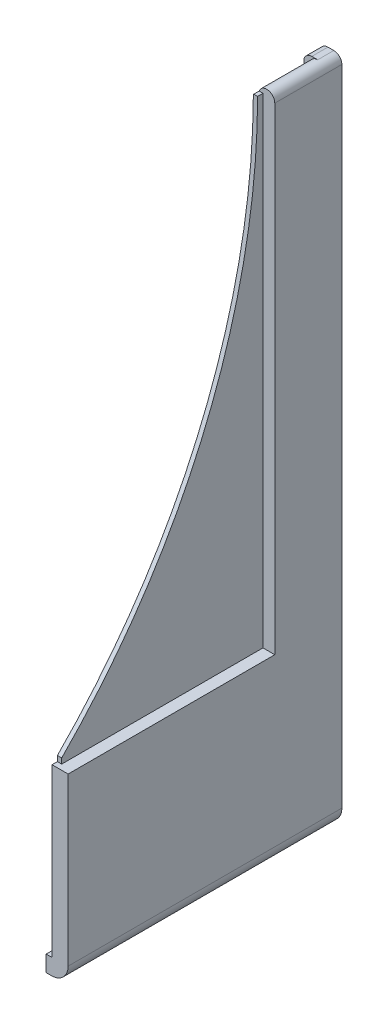
ISO-10303-21;
HEADER;
FILE_DESCRIPTION(('STEP AP214'),'2;1');
FILE_NAME('part.step','',(''),(''),'','','');
FILE_SCHEMA(('AUTOMOTIVE_DESIGN { 1 0 10303 214 1 1 1 1 }'));
ENDSEC;
DATA;
#1=APPLICATION_CONTEXT('core data for automotive mechanical design processes');
#2=APPLICATION_PROTOCOL_DEFINITION('international standard','automotive_design',2000,#1);
#3=PRODUCT_CONTEXT('',#1,'mechanical');
#4=PRODUCT('Part','Part','',(#3));
#5=PRODUCT_RELATED_PRODUCT_CATEGORY('part','',(#4));
#6=PRODUCT_DEFINITION_FORMATION('','',#4);
#7=PRODUCT_DEFINITION_CONTEXT('part definition',#1,'design');
#8=PRODUCT_DEFINITION('design','',#6,#7);
#9=PRODUCT_DEFINITION_SHAPE('','',#8);
#10=(LENGTH_UNIT() NAMED_UNIT(*) SI_UNIT(.MILLI.,.METRE.));
#11=(NAMED_UNIT(*) PLANE_ANGLE_UNIT() SI_UNIT($,.RADIAN.));
#12=(NAMED_UNIT(*) SI_UNIT($,.STERADIAN.) SOLID_ANGLE_UNIT());
#13=UNCERTAINTY_MEASURE_WITH_UNIT(LENGTH_MEASURE(1.E-05),#10,'distance_accuracy_value','');
#14=(GEOMETRIC_REPRESENTATION_CONTEXT(3) GLOBAL_UNCERTAINTY_ASSIGNED_CONTEXT((#13)) GLOBAL_UNIT_ASSIGNED_CONTEXT((#10,
#11,#12)) REPRESENTATION_CONTEXT('',''));
#15=CARTESIAN_POINT('',(0.,0.,0.));
#16=DIRECTION('',(0.,0.,1.));
#17=DIRECTION('',(1.,0.,0.));
#18=AXIS2_PLACEMENT_3D('',#15,#16,#17);
#19=CARTESIAN_POINT('',(2.59999999999955,120.1,48.));
#20=DIRECTION('',(0.,0.,-1.));
#21=DIRECTION('',(-1.,0.,0.));
#22=AXIS2_PLACEMENT_3D('',#19,#20,#21);
#23=CYLINDRICAL_SURFACE('',#22,1.5);
#24=DIRECTION('',(0.,0.,-1.));
#25=VECTOR('',#24,1.);
#26=CARTESIAN_POINT('',(1.09999999999955,120.1,48.));
#27=LINE('',#26,#25);
#28=CARTESIAN_POINT('',(1.09999999999955,120.1,10.5009956938389));
#29=VERTEX_POINT('',#28);
#30=CARTESIAN_POINT('',(1.09999999999955,120.1,0.));
#31=VERTEX_POINT('',#30);
#32=EDGE_CURVE('E12',#29,#31,#27,.T.);
#33=ORIENTED_EDGE('',*,*,#32,.F.);
#34=CARTESIAN_POINT('',(1.09999999999955,120.1,10.5009956938389));
#35=CARTESIAN_POINT('',(1.09999564035827,120.142632618884,10.5008256892034));
#36=CARTESIAN_POINT('',(1.1018175294464,120.185264580547,10.5006778200858));
#37=CARTESIAN_POINT('',(1.10905490204229,120.269914805577,10.5004269151483));
#38=CARTESIAN_POINT('',(1.11444455078887,120.311935277481,10.5003235657701));
#39=CARTESIAN_POINT('',(1.12875960021935,120.395369667685,10.5001598389847));
#40=CARTESIAN_POINT('',(1.13768500090208,120.436783585987,10.5000994615775));
#41=CARTESIAN_POINT('',(1.15907832458292,120.519005373769,10.5000193019113));
#42=CARTESIAN_POINT('',(1.17157134151145,120.559806715017,10.4999998156802));
#43=CARTESIAN_POINT('',(1.18578643762645,120.6,10.5));
#44=B_SPLINE_CURVE_WITH_KNOTS('',3,(#34,#35,#36,#37,#38,#39,#40,#41,#42,#43),.UNSPECIFIED.,.F.,
.F.,(4,2,2,2,4),(0.,0.127858771512731,0.254801677722977,0.381744583891194,0.509603355408305),.UNSPECIFIED.);
#45=CARTESIAN_POINT('',(1.18578643762645,120.6,10.5));
#46=VERTEX_POINT('',#45);
#47=EDGE_CURVE('E197',#29,#46,#44,.T.);
#48=ORIENTED_EDGE('',*,*,#47,.T.);
#49=DIRECTION('',(0.,0.,-1.));
#50=VECTOR('',#49,1.);
#51=CARTESIAN_POINT('',(1.18578643762645,120.6,48.));
#52=LINE('',#51,#50);
#53=CARTESIAN_POINT('',(1.18578643762645,120.6,9.50000000000001));
#54=VERTEX_POINT('',#53);
#55=EDGE_CURVE('E162',#46,#54,#52,.T.);
#56=ORIENTED_EDGE('',*,*,#55,.T.);
#57=CARTESIAN_POINT('',(2.59999999999955,120.1,9.50000000000001));
#58=DIRECTION('',(0.,0.,-1.));
#59=DIRECTION('',(0.,1.,0.));
#60=AXIS2_PLACEMENT_3D('',#57,#58,#59);
#61=CIRCLE('',#60,1.5);
#62=CARTESIAN_POINT('',(4.09999999999955,120.1,9.50000000000001));
#63=VERTEX_POINT('',#62);
#64=EDGE_CURVE('E289',#63,#54,#61,.F.);
#65=ORIENTED_EDGE('',*,*,#64,.F.);
#66=DIRECTION('',(0.,0.,-1.));
#67=VECTOR('',#66,1.);
#68=CARTESIAN_POINT('',(4.09999999999955,120.1,48.));
#69=LINE('',#68,#67);
#70=CARTESIAN_POINT('',(4.09999999999955,120.1,-3.));
#71=VERTEX_POINT('',#70);
#72=EDGE_CURVE('E340',#63,#71,#69,.T.);
#73=ORIENTED_EDGE('',*,*,#72,.T.);
#74=CARTESIAN_POINT('',(2.59999999999955,120.1,-3.));
#75=DIRECTION('',(0.,0.,-1.));
#76=DIRECTION('',(-1.,0.,0.));
#77=AXIS2_PLACEMENT_3D('',#74,#75,#76);
#78=CIRCLE('',#77,1.5);
#79=CARTESIAN_POINT('',(2.59999999999955,121.6,-3.));
#80=VERTEX_POINT('',#79);
#81=EDGE_CURVE('E295',#80,#71,#78,.T.);
#82=ORIENTED_EDGE('',*,*,#81,.F.);
#83=DIRECTION('',(0.,0.,1.));
#84=VECTOR('',#83,1.);
#85=CARTESIAN_POINT('',(2.59999999999955,121.6,-3.));
#86=LINE('',#85,#84);
#87=CARTESIAN_POINT('',(2.59999999999955,121.6,0.));
#88=VERTEX_POINT('',#87);
#89=EDGE_CURVE('E347',#80,#88,#86,.T.);
#90=ORIENTED_EDGE('',*,*,#89,.T.);
#91=CARTESIAN_POINT('',(2.59999999999955,120.1,0.));
#92=DIRECTION('',(0.,0.,1.));
#93=DIRECTION('',(1.,0.,0.));
#94=AXIS2_PLACEMENT_3D('',#91,#92,#93);
#95=CIRCLE('',#94,1.5);
#96=EDGE_CURVE('E62',#31,#88,#95,.F.);
#97=ORIENTED_EDGE('',*,*,#96,.F.);
#98=EDGE_LOOP('',(#33,#48,#56,#65,#73,#82,#90,#97));
#99=FACE_BOUND('',#98,.T.);
#100=ADVANCED_FACE('F37',(#99),#23,.T.);
#101=CARTESIAN_POINT('',(1.1,0.,48.));
#102=DIRECTION('',(-1.,0.,0.));
#103=DIRECTION('',(0.,-1.,0.));
#104=AXIS2_PLACEMENT_3D('',#101,#102,#103);
#105=PLANE('',#104);
#106=DIRECTION('',(0.,-1.,0.));
#107=VECTOR('',#106,1.);
#108=CARTESIAN_POINT('',(1.1,0.,47.));
#109=LINE('',#108,#107);
#110=CARTESIAN_POINT('',(1.09999999999988,32.1,47.));
#111=VERTEX_POINT('',#110);
#112=CARTESIAN_POINT('',(1.09999999999988,31.1,47.));
#113=VERTEX_POINT('',#112);
#114=EDGE_CURVE('E192',#111,#113,#109,.T.);
#115=ORIENTED_EDGE('',*,*,#114,.F.);
#116=CARTESIAN_POINT('',(1.09999999999955,120.6,136.041095890411));
#117=DIRECTION('',(-1.,0.,0.));
#118=DIRECTION('',(0.,-1.,0.));
#119=AXIS2_PLACEMENT_3D('',#116,#117,#118);
#120=CIRCLE('',#119,125.541095890411);
#121=EDGE_CURVE('E194',#111,#29,#120,.F.);
#122=ORIENTED_EDGE('',*,*,#121,.T.);
#123=ORIENTED_EDGE('',*,*,#32,.T.);
#124=DIRECTION('',(0.,1.,0.));
#125=VECTOR('',#124,1.);
#126=CARTESIAN_POINT('',(1.1,0.,0.));
#127=LINE('',#126,#125);
#128=CARTESIAN_POINT('',(1.1,0.1,0.));
#129=VERTEX_POINT('',#128);
#130=EDGE_CURVE('E343',#129,#31,#127,.T.);
#131=ORIENTED_EDGE('',*,*,#130,.F.);
#132=DIRECTION('',(0.,0.,-1.));
#133=VECTOR('',#132,1.);
#134=CARTESIAN_POINT('',(1.1,0.1,48.));
#135=LINE('',#134,#133);
#136=CARTESIAN_POINT('',(1.1,0.1,48.));
#137=VERTEX_POINT('',#136);
#138=EDGE_CURVE('E46',#137,#129,#135,.T.);
#139=ORIENTED_EDGE('',*,*,#138,.F.);
#140=DIRECTION('',(0.,1.,0.));
#141=VECTOR('',#140,1.);
#142=CARTESIAN_POINT('',(1.1,0.,48.));
#143=LINE('',#142,#141);
#144=CARTESIAN_POINT('',(1.09999999999977,31.1,48.));
#145=VERTEX_POINT('',#144);
#146=EDGE_CURVE('E321',#137,#145,#143,.T.);
#147=ORIENTED_EDGE('',*,*,#146,.T.);
#148=DIRECTION('',(0.,0.,1.));
#149=VECTOR('',#148,1.);
#150=CARTESIAN_POINT('',(1.09999999999988,31.1,48.));
#151=LINE('',#150,#149);
#152=EDGE_CURVE('E189',#113,#145,#151,.T.);
#153=ORIENTED_EDGE('',*,*,#152,.F.);
#154=EDGE_LOOP('',(#115,#122,#123,#131,#139,#147,#153));
#155=FACE_BOUND('',#154,.T.);
#156=ADVANCED_FACE('F263',(#155),#105,.T.);
#157=CARTESIAN_POINT('',(0.999999999999999,0.0999999999999998,48.));
#158=DIRECTION('',(0.,0.,-1.));
#159=DIRECTION('',(-1.,0.,0.));
#160=AXIS2_PLACEMENT_3D('',#157,#158,#159);
#161=CYLINDRICAL_SURFACE('',#160,0.0999999999999996);
#162=CARTESIAN_POINT('',(0.999999999999999,0.0999999999999998,0.));
#163=DIRECTION('',(0.,0.,1.));
#164=DIRECTION('',(1.,0.,0.));
#165=AXIS2_PLACEMENT_3D('',#162,#163,#164);
#166=CIRCLE('',#165,0.0999999999999996);
#167=CARTESIAN_POINT('',(0.999999999999999,0.,0.));
#168=VERTEX_POINT('',#167);
#169=EDGE_CURVE('E357',#168,#129,#166,.T.);
#170=ORIENTED_EDGE('',*,*,#169,.F.);
#171=DIRECTION('',(0.,0.,-1.));
#172=VECTOR('',#171,1.);
#173=CARTESIAN_POINT('',(0.999999999999999,0.,48.));
#174=LINE('',#173,#172);
#175=CARTESIAN_POINT('',(0.999999999999999,0.,48.));
#176=VERTEX_POINT('',#175);
#177=EDGE_CURVE('E351',#176,#168,#174,.T.);
#178=ORIENTED_EDGE('',*,*,#177,.F.);
#179=CARTESIAN_POINT('',(0.999999999999999,0.0999999999999998,48.));
#180=DIRECTION('',(0.,0.,1.));
#181=DIRECTION('',(1.,0.,0.));
#182=AXIS2_PLACEMENT_3D('',#179,#180,#181);
#183=CIRCLE('',#182,0.0999999999999996);
#184=EDGE_CURVE('E323',#176,#137,#183,.T.);
#185=ORIENTED_EDGE('',*,*,#184,.T.);
#186=ORIENTED_EDGE('',*,*,#138,.T.);
#187=EDGE_LOOP('',(#170,#178,#185,#186));
#188=FACE_BOUND('',#187,.T.);
#189=ADVANCED_FACE('F260',(#188),#161,.F.);
#190=CARTESIAN_POINT('',(0.,0.,48.));
#191=DIRECTION('',(0.,1.,0.));
#192=DIRECTION('',(0.,0.,1.));
#193=AXIS2_PLACEMENT_3D('',#190,#191,#192);
#194=PLANE('',#193);
#195=DIRECTION('',(1.,0.,0.));
#196=VECTOR('',#195,1.);
#197=CARTESIAN_POINT('',(0.,0.,0.));
#198=LINE('',#197,#196);
#199=CARTESIAN_POINT('',(0.,0.,0.));
#200=VERTEX_POINT('',#199);
#201=EDGE_CURVE('E324',#200,#168,#198,.T.);
#202=ORIENTED_EDGE('',*,*,#201,.F.);
#203=DIRECTION('',(0.,0.,-1.));
#204=VECTOR('',#203,1.);
#205=CARTESIAN_POINT('',(0.,0.,48.));
#206=LINE('',#205,#204);
#207=CARTESIAN_POINT('',(0.,0.,48.));
#208=VERTEX_POINT('',#207);
#209=EDGE_CURVE('E349',#208,#200,#206,.T.);
#210=ORIENTED_EDGE('',*,*,#209,.F.);
#211=DIRECTION('',(1.,0.,0.));
#212=VECTOR('',#211,1.);
#213=CARTESIAN_POINT('',(0.,0.,48.));
#214=LINE('',#213,#212);
#215=EDGE_CURVE('E327',#208,#176,#214,.T.);
#216=ORIENTED_EDGE('',*,*,#215,.T.);
#217=ORIENTED_EDGE('',*,*,#177,.T.);
#218=EDGE_LOOP('',(#202,#210,#216,#217));
#219=FACE_BOUND('',#218,.T.);
#220=ADVANCED_FACE('F256',(#219),#194,.T.);
#221=CARTESIAN_POINT('',(0.,0.,48.));
#222=DIRECTION('',(-1.,0.,0.));
#223=DIRECTION('',(0.,0.,1.));
#224=AXIS2_PLACEMENT_3D('',#221,#222,#223);
#225=PLANE('',#224);
#226=ORIENTED_EDGE('',*,*,#209,.T.);
#227=DIRECTION('',(0.,1.,0.));
#228=VECTOR('',#227,1.);
#229=CARTESIAN_POINT('',(0.,0.,0.));
#230=LINE('',#229,#228);
#231=CARTESIAN_POINT('',(0.,120.1,0.));
#232=VERTEX_POINT('',#231);
#233=EDGE_CURVE('E317',#200,#232,#230,.T.);
#234=ORIENTED_EDGE('',*,*,#233,.T.);
#235=DIRECTION('',(0.,0.,1.));
#236=VECTOR('',#235,1.);
#237=CARTESIAN_POINT('',(0.,120.1,-3.));
#238=LINE('',#237,#236);
#239=CARTESIAN_POINT('',(0.,120.1,-3.));
#240=VERTEX_POINT('',#239);
#241=EDGE_CURVE('E320',#240,#232,#238,.T.);
#242=ORIENTED_EDGE('',*,*,#241,.F.);
#243=DIRECTION('',(0.,1.,0.));
#244=VECTOR('',#243,1.);
#245=CARTESIAN_POINT('',(0.,0.,-3.));
#246=LINE('',#245,#244);
#247=CARTESIAN_POINT('',(0.,-3.,-3.));
#248=VERTEX_POINT('',#247);
#249=EDGE_CURVE('E308',#248,#240,#246,.T.);
#250=ORIENTED_EDGE('',*,*,#249,.F.);
#251=DIRECTION('',(0.,0.,-1.));
#252=VECTOR('',#251,1.);
#253=CARTESIAN_POINT('',(0.,-3.,48.));
#254=LINE('',#253,#252);
#255=CARTESIAN_POINT('',(0.,-3.,48.));
#256=VERTEX_POINT('',#255);
#257=EDGE_CURVE('E352',#256,#248,#254,.T.);
#258=ORIENTED_EDGE('',*,*,#257,.F.);
#259=DIRECTION('',(0.,1.,0.));
#260=VECTOR('',#259,1.);
#261=CARTESIAN_POINT('',(0.,0.,48.));
#262=LINE('',#261,#260);
#263=EDGE_CURVE('E330',#256,#208,#262,.T.);
#264=ORIENTED_EDGE('',*,*,#263,.T.);
#265=EDGE_LOOP('',(#226,#234,#242,#250,#258,#264));
#266=FACE_BOUND('',#265,.T.);
#267=ADVANCED_FACE('F252',(#266),#225,.T.);
#268=CARTESIAN_POINT('',(0.,-3.,48.));
#269=DIRECTION('',(0.,1.,0.));
#270=DIRECTION('',(0.,0.,1.));
#271=AXIS2_PLACEMENT_3D('',#268,#269,#270);
#272=PLANE('',#271);
#273=ORIENTED_EDGE('',*,*,#257,.T.);
#274=DIRECTION('',(-1.,0.,0.));
#275=VECTOR('',#274,1.);
#276=CARTESIAN_POINT('',(0.,-3.,-3.));
#277=LINE('',#276,#275);
#278=CARTESIAN_POINT('',(0.999999999999999,-3.,-3.));
#279=VERTEX_POINT('',#278);
#280=EDGE_CURVE('E305',#279,#248,#277,.T.);
#281=ORIENTED_EDGE('',*,*,#280,.F.);
#282=DIRECTION('',(0.,0.,-1.));
#283=VECTOR('',#282,1.);
#284=CARTESIAN_POINT('',(0.999999999999999,-3.,48.));
#285=LINE('',#284,#283);
#286=CARTESIAN_POINT('',(0.999999999999999,-3.,48.));
#287=VERTEX_POINT('',#286);
#288=EDGE_CURVE('E383',#287,#279,#285,.T.);
#289=ORIENTED_EDGE('',*,*,#288,.F.);
#290=DIRECTION('',(1.,0.,0.));
#291=VECTOR('',#290,1.);
#292=CARTESIAN_POINT('',(0.,-3.,48.));
#293=LINE('',#292,#291);
#294=EDGE_CURVE('E333',#256,#287,#293,.T.);
#295=ORIENTED_EDGE('',*,*,#294,.F.);
#296=EDGE_LOOP('',(#273,#281,#289,#295));
#297=FACE_BOUND('',#296,.T.);
#298=ADVANCED_FACE('F248',(#297),#272,.F.);
#299=CARTESIAN_POINT('',(0.999999999999999,0.0999999999999998,48.));
#300=DIRECTION('',(0.,0.,-1.));
#301=DIRECTION('',(-1.,0.,0.));
#302=AXIS2_PLACEMENT_3D('',#299,#300,#301);
#303=CYLINDRICAL_SURFACE('',#302,3.1);
#304=ORIENTED_EDGE('',*,*,#288,.T.);
#305=CARTESIAN_POINT('',(0.999999999999999,0.0999999999999998,-3.));
#306=DIRECTION('',(0.,0.,-1.));
#307=DIRECTION('',(-1.,0.,0.));
#308=AXIS2_PLACEMENT_3D('',#305,#306,#307);
#309=CIRCLE('',#308,3.1);
#310=CARTESIAN_POINT('',(4.1,0.0999999999999998,-3.));
#311=VERTEX_POINT('',#310);
#312=EDGE_CURVE('E302',#311,#279,#309,.T.);
#313=ORIENTED_EDGE('',*,*,#312,.F.);
#314=DIRECTION('',(0.,0.,-1.));
#315=VECTOR('',#314,1.);
#316=CARTESIAN_POINT('',(4.1,0.10000000000001,48.));
#317=LINE('',#316,#315);
#318=CARTESIAN_POINT('',(4.1,0.10000000000001,48.));
#319=VERTEX_POINT('',#318);
#320=EDGE_CURVE('E381',#319,#311,#317,.T.);
#321=ORIENTED_EDGE('',*,*,#320,.F.);
#322=CARTESIAN_POINT('',(0.999999999999999,0.0999999999999998,48.));
#323=DIRECTION('',(0.,0.,1.));
#324=DIRECTION('',(1.,0.,0.));
#325=AXIS2_PLACEMENT_3D('',#322,#323,#324);
#326=CIRCLE('',#325,3.1);
#327=EDGE_CURVE('E335',#287,#319,#326,.T.);
#328=ORIENTED_EDGE('',*,*,#327,.F.);
#329=EDGE_LOOP('',(#304,#313,#321,#328));
#330=FACE_BOUND('',#329,.T.);
#331=ADVANCED_FACE('F244',(#330),#303,.T.);
#332=CARTESIAN_POINT('',(4.1,0.,48.));
#333=DIRECTION('',(-1.,0.,0.));
#334=DIRECTION('',(0.,-1.,0.));
#335=AXIS2_PLACEMENT_3D('',#332,#333,#334);
#336=PLANE('',#335);
#337=DIRECTION('',(0.,1.,0.));
#338=VECTOR('',#337,1.);
#339=CARTESIAN_POINT('',(4.09999999999954,121.6,9.50000000000001));
#340=LINE('',#339,#338);
#341=CARTESIAN_POINT('',(4.09999999999988,31.1,9.49999999999999));
#342=VERTEX_POINT('',#341);
#343=EDGE_CURVE('E204',#342,#63,#340,.T.);
#344=ORIENTED_EDGE('',*,*,#343,.F.);
#345=DIRECTION('',(0.,0.,-1.));
#346=VECTOR('',#345,1.);
#347=CARTESIAN_POINT('',(4.09999999999988,31.1,48.));
#348=LINE('',#347,#346);
#349=CARTESIAN_POINT('',(4.09999999999988,31.1,48.));
#350=VERTEX_POINT('',#349);
#351=EDGE_CURVE('E203',#350,#342,#348,.T.);
#352=ORIENTED_EDGE('',*,*,#351,.F.);
#353=DIRECTION('',(0.,1.,0.));
#354=VECTOR('',#353,1.);
#355=CARTESIAN_POINT('',(4.1,0.,48.));
#356=LINE('',#355,#354);
#357=EDGE_CURVE('E337',#319,#350,#356,.T.);
#358=ORIENTED_EDGE('',*,*,#357,.F.);
#359=ORIENTED_EDGE('',*,*,#320,.T.);
#360=DIRECTION('',(0.,-1.,0.));
#361=VECTOR('',#360,1.);
#362=CARTESIAN_POINT('',(4.1,0.,-3.));
#363=LINE('',#362,#361);
#364=EDGE_CURVE('E299',#71,#311,#363,.T.);
#365=ORIENTED_EDGE('',*,*,#364,.F.);
#366=ORIENTED_EDGE('',*,*,#72,.F.);
#367=EDGE_LOOP('',(#344,#352,#358,#359,#365,#366));
#368=FACE_BOUND('',#367,.T.);
#369=ADVANCED_FACE('F240',(#368),#336,.F.);
#370=CARTESIAN_POINT('',(0.,0.,48.));
#371=DIRECTION('',(0.,0.,1.));
#372=DIRECTION('',(1.,0.,0.));
#373=AXIS2_PLACEMENT_3D('',#370,#371,#372);
#374=PLANE('',#373);
#375=DIRECTION('',(1.,0.,0.));
#376=VECTOR('',#375,1.);
#377=CARTESIAN_POINT('',(-97.2488688292856,31.0999999999996,48.));
#378=LINE('',#377,#376);
#379=EDGE_CURVE('E286',#145,#350,#378,.T.);
#380=ORIENTED_EDGE('',*,*,#379,.F.);
#381=ORIENTED_EDGE('',*,*,#146,.F.);
#382=ORIENTED_EDGE('',*,*,#184,.F.);
#383=ORIENTED_EDGE('',*,*,#215,.F.);
#384=ORIENTED_EDGE('',*,*,#263,.F.);
#385=ORIENTED_EDGE('',*,*,#294,.T.);
#386=ORIENTED_EDGE('',*,*,#327,.T.);
#387=ORIENTED_EDGE('',*,*,#357,.T.);
#388=EDGE_LOOP('',(#380,#381,#382,#383,#384,#385,#386,#387));
#389=FACE_BOUND('',#388,.T.);
#390=ADVANCED_FACE('F231',(#389),#374,.T.);
#391=CARTESIAN_POINT('',(0.,0.,0.));
#392=DIRECTION('',(0.,0.,-1.));
#393=DIRECTION('',(-1.,0.,0.));
#394=AXIS2_PLACEMENT_3D('',#391,#392,#393);
#395=PLANE('',#394);
#396=ORIENTED_EDGE('',*,*,#130,.T.);
#397=ORIENTED_EDGE('',*,*,#96,.T.);
#398=DIRECTION('',(1.,0.,0.));
#399=VECTOR('',#398,1.);
#400=CARTESIAN_POINT('',(0.,121.6,0.));
#401=LINE('',#400,#399);
#402=CARTESIAN_POINT('',(1.5,121.6,0.));
#403=VERTEX_POINT('',#402);
#404=EDGE_CURVE('E291',#403,#88,#401,.T.);
#405=ORIENTED_EDGE('',*,*,#404,.F.);
#406=CARTESIAN_POINT('',(1.5,120.1,0.));
#407=DIRECTION('',(0.,0.,-1.));
#408=DIRECTION('',(-1.,0.,0.));
#409=AXIS2_PLACEMENT_3D('',#406,#407,#408);
#410=CIRCLE('',#409,1.5);
#411=EDGE_CURVE('E296',#232,#403,#410,.T.);
#412=ORIENTED_EDGE('',*,*,#411,.F.);
#413=ORIENTED_EDGE('',*,*,#233,.F.);
#414=ORIENTED_EDGE('',*,*,#201,.T.);
#415=ORIENTED_EDGE('',*,*,#169,.T.);
#416=EDGE_LOOP('',(#396,#397,#405,#412,#413,#414,#415));
#417=FACE_BOUND('',#416,.T.);
#418=ADVANCED_FACE('F227',(#417),#395,.F.);
#419=CARTESIAN_POINT('',(0.,121.6,-3.));
#420=DIRECTION('',(0.,-1.,0.));
#421=DIRECTION('',(0.,0.,-1.));
#422=AXIS2_PLACEMENT_3D('',#419,#420,#421);
#423=PLANE('',#422);
#424=ORIENTED_EDGE('',*,*,#404,.T.);
#425=ORIENTED_EDGE('',*,*,#89,.F.);
#426=DIRECTION('',(1.,0.,0.));
#427=VECTOR('',#426,1.);
#428=CARTESIAN_POINT('',(0.,121.6,-3.));
#429=LINE('',#428,#427);
#430=CARTESIAN_POINT('',(1.5,121.6,-3.));
#431=VERTEX_POINT('',#430);
#432=EDGE_CURVE('E292',#431,#80,#429,.T.);
#433=ORIENTED_EDGE('',*,*,#432,.F.);
#434=DIRECTION('',(0.,0.,1.));
#435=VECTOR('',#434,1.);
#436=CARTESIAN_POINT('',(1.5,121.6,-3.));
#437=LINE('',#436,#435);
#438=EDGE_CURVE('E312',#431,#403,#437,.T.);
#439=ORIENTED_EDGE('',*,*,#438,.T.);
#440=EDGE_LOOP('',(#424,#425,#433,#439));
#441=FACE_BOUND('',#440,.T.);
#442=ADVANCED_FACE('F230',(#441),#423,.F.);
#443=CARTESIAN_POINT('',(1.5,120.1,-3.));
#444=DIRECTION('',(0.,0.,1.));
#445=DIRECTION('',(1.,0.,0.));
#446=AXIS2_PLACEMENT_3D('',#443,#444,#445);
#447=CYLINDRICAL_SURFACE('',#446,1.5);
#448=ORIENTED_EDGE('',*,*,#411,.T.);
#449=ORIENTED_EDGE('',*,*,#438,.F.);
#450=CARTESIAN_POINT('',(1.5,120.1,-3.));
#451=DIRECTION('',(0.,0.,-1.));
#452=DIRECTION('',(-1.,0.,0.));
#453=AXIS2_PLACEMENT_3D('',#450,#451,#452);
#454=CIRCLE('',#453,1.5);
#455=EDGE_CURVE('E310',#240,#431,#454,.T.);
#456=ORIENTED_EDGE('',*,*,#455,.F.);
#457=ORIENTED_EDGE('',*,*,#241,.T.);
#458=EDGE_LOOP('',(#448,#449,#456,#457));
#459=FACE_BOUND('',#458,.T.);
#460=ADVANCED_FACE('F225',(#459),#447,.T.);
#461=CARTESIAN_POINT('',(0.,0.,-3.));
#462=DIRECTION('',(0.,0.,-1.));
#463=DIRECTION('',(-1.,0.,0.));
#464=AXIS2_PLACEMENT_3D('',#461,#462,#463);
#465=PLANE('',#464);
#466=ORIENTED_EDGE('',*,*,#432,.T.);
#467=ORIENTED_EDGE('',*,*,#81,.T.);
#468=ORIENTED_EDGE('',*,*,#364,.T.);
#469=ORIENTED_EDGE('',*,*,#312,.T.);
#470=ORIENTED_EDGE('',*,*,#280,.T.);
#471=ORIENTED_EDGE('',*,*,#249,.T.);
#472=ORIENTED_EDGE('',*,*,#455,.T.);
#473=EDGE_LOOP('',(#466,#467,#468,#469,#470,#471,#472));
#474=FACE_BOUND('',#473,.T.);
#475=ADVANCED_FACE('F222',(#474),#465,.T.);
#476=CARTESIAN_POINT('',(1.9,0.,48.));
#477=DIRECTION('',(-1.,0.,0.));
#478=DIRECTION('',(0.,-1.,0.));
#479=AXIS2_PLACEMENT_3D('',#476,#477,#478);
#480=PLANE('',#479);
#481=CARTESIAN_POINT('',(1.89999999999955,120.6,136.041095890411));
#482=DIRECTION('',(1.,0.,0.));
#483=DIRECTION('',(0.,1.,0.));
#484=AXIS2_PLACEMENT_3D('',#481,#482,#483);
#485=CIRCLE('',#484,125.541095890411);
#486=CARTESIAN_POINT('',(1.89999999999955,120.6,10.5));
#487=VERTEX_POINT('',#486);
#488=CARTESIAN_POINT('',(1.89999999999988,32.1,47.));
#489=VERTEX_POINT('',#488);
#490=EDGE_CURVE('E169',#487,#489,#485,.F.);
#491=ORIENTED_EDGE('',*,*,#490,.T.);
#492=DIRECTION('',(0.,1.,0.));
#493=VECTOR('',#492,1.);
#494=CARTESIAN_POINT('',(1.9,0.,47.));
#495=LINE('',#494,#493);
#496=CARTESIAN_POINT('',(1.89999999999988,31.1,47.));
#497=VERTEX_POINT('',#496);
#498=EDGE_CURVE('E166',#497,#489,#495,.T.);
#499=ORIENTED_EDGE('',*,*,#498,.F.);
#500=DIRECTION('',(0.,0.,-1.));
#501=VECTOR('',#500,1.);
#502=CARTESIAN_POINT('',(1.89999999999989,31.1,48.));
#503=LINE('',#502,#501);
#504=CARTESIAN_POINT('',(1.89999999999989,31.1,9.49999999999999));
#505=VERTEX_POINT('',#504);
#506=EDGE_CURVE('E279',#497,#505,#503,.T.);
#507=ORIENTED_EDGE('',*,*,#506,.T.);
#508=DIRECTION('',(0.,1.,0.));
#509=VECTOR('',#508,1.);
#510=CARTESIAN_POINT('',(1.89999999999954,121.6,9.50000000000001));
#511=LINE('',#510,#509);
#512=CARTESIAN_POINT('',(1.89999999999954,120.6,9.50000000000001));
#513=VERTEX_POINT('',#512);
#514=EDGE_CURVE('E180',#505,#513,#511,.T.);
#515=ORIENTED_EDGE('',*,*,#514,.T.);
#516=DIRECTION('',(0.,0.,1.));
#517=VECTOR('',#516,1.);
#518=CARTESIAN_POINT('',(1.89999999999955,120.6,0.));
#519=LINE('',#518,#517);
#520=EDGE_CURVE('E54',#513,#487,#519,.T.);
#521=ORIENTED_EDGE('',*,*,#520,.T.);
#522=EDGE_LOOP('',(#491,#499,#507,#515,#521));
#523=FACE_BOUND('',#522,.T.);
#524=ADVANCED_FACE('F178',(#523),#480,.F.);
#525=CARTESIAN_POINT('',(-97.2488688292856,31.0999999999996,48.));
#526=DIRECTION('',(0.,-1.,0.));
#527=DIRECTION('',(1.,0.,0.));
#528=AXIS2_PLACEMENT_3D('',#525,#526,#527);
#529=PLANE('',#528);
#530=ORIENTED_EDGE('',*,*,#379,.T.);
#531=ORIENTED_EDGE('',*,*,#351,.T.);
#532=DIRECTION('',(1.,0.,0.));
#533=VECTOR('',#532,1.);
#534=CARTESIAN_POINT('',(-97.2488688292856,31.0999999999996,9.49999999999999));
#535=LINE('',#534,#533);
#536=EDGE_CURVE('E281',#505,#342,#535,.T.);
#537=ORIENTED_EDGE('',*,*,#536,.F.);
#538=ORIENTED_EDGE('',*,*,#506,.F.);
#539=DIRECTION('',(1.,0.,0.));
#540=VECTOR('',#539,1.);
#541=CARTESIAN_POINT('',(-5.00000001272052E-05,31.1,47.));
#542=LINE('',#541,#540);
#543=EDGE_CURVE('E185',#113,#497,#542,.T.);
#544=ORIENTED_EDGE('',*,*,#543,.F.);
#545=ORIENTED_EDGE('',*,*,#152,.T.);
#546=EDGE_LOOP('',(#530,#531,#537,#538,#544,#545));
#547=FACE_BOUND('',#546,.T.);
#548=ADVANCED_FACE('F215',(#547),#529,.F.);
#549=CARTESIAN_POINT('',(-97.2488688292859,121.6,9.50000000000001));
#550=DIRECTION('',(0.,0.,-1.));
#551=DIRECTION('',(0.,1.,0.));
#552=AXIS2_PLACEMENT_3D('',#549,#550,#551);
#553=PLANE('',#552);
#554=ORIENTED_EDGE('',*,*,#64,.T.);
#555=DIRECTION('',(1.,0.,0.));
#556=VECTOR('',#555,1.);
#557=CARTESIAN_POINT('',(-5.00000004613563E-05,120.6,9.50000000000001));
#558=LINE('',#557,#556);
#559=EDGE_CURVE('E165',#54,#513,#558,.T.);
#560=ORIENTED_EDGE('',*,*,#559,.T.);
#561=ORIENTED_EDGE('',*,*,#514,.F.);
#562=ORIENTED_EDGE('',*,*,#536,.T.);
#563=ORIENTED_EDGE('',*,*,#343,.T.);
#564=EDGE_LOOP('',(#554,#560,#561,#562,#563));
#565=FACE_BOUND('',#564,.T.);
#566=ADVANCED_FACE('F211',(#565),#553,.F.);
#567=CARTESIAN_POINT('',(-5.00000004613563E-05,120.6,136.041095890411));
#568=DIRECTION('',(1.,0.,0.));
#569=DIRECTION('',(0.,1.,0.));
#570=AXIS2_PLACEMENT_3D('',#567,#568,#569);
#571=CYLINDRICAL_SURFACE('',#570,125.541095890411);
#572=ORIENTED_EDGE('',*,*,#121,.F.);
#573=DIRECTION('',(1.,0.,0.));
#574=VECTOR('',#573,1.);
#575=CARTESIAN_POINT('',(-5.00000001308915E-05,32.1,47.));
#576=LINE('',#575,#574);
#577=EDGE_CURVE('E172',#111,#489,#576,.T.);
#578=ORIENTED_EDGE('',*,*,#577,.T.);
#579=ORIENTED_EDGE('',*,*,#490,.F.);
#580=DIRECTION('',(1.,0.,0.));
#581=VECTOR('',#580,1.);
#582=CARTESIAN_POINT('',(-5.00000004613563E-05,120.6,10.5));
#583=LINE('',#582,#581);
#584=EDGE_CURVE('E158',#46,#487,#583,.T.);
#585=ORIENTED_EDGE('',*,*,#584,.F.);
#586=ORIENTED_EDGE('',*,*,#47,.F.);
#587=EDGE_LOOP('',(#572,#578,#579,#585,#586));
#588=FACE_BOUND('',#587,.T.);
#589=ADVANCED_FACE('F170',(#588),#571,.F.);
#590=CARTESIAN_POINT('',(-5.00000000111956E-05,0.,47.));
#591=DIRECTION('',(0.,0.,-1.));
#592=DIRECTION('',(-1.,0.,0.));
#593=AXIS2_PLACEMENT_3D('',#590,#591,#592);
#594=PLANE('',#593);
#595=ORIENTED_EDGE('',*,*,#114,.T.);
#596=ORIENTED_EDGE('',*,*,#543,.T.);
#597=ORIENTED_EDGE('',*,*,#498,.T.);
#598=ORIENTED_EDGE('',*,*,#577,.F.);
#599=EDGE_LOOP('',(#595,#596,#597,#598));
#600=FACE_BOUND('',#599,.T.);
#601=ADVANCED_FACE('F210',(#600),#594,.F.);
#602=CARTESIAN_POINT('',(-5.00000004613563E-05,120.6,0.));
#603=DIRECTION('',(0.,1.,0.));
#604=DIRECTION('',(-1.,0.,0.));
#605=AXIS2_PLACEMENT_3D('',#602,#603,#604);
#606=PLANE('',#605);
#607=ORIENTED_EDGE('',*,*,#584,.T.);
#608=ORIENTED_EDGE('',*,*,#520,.F.);
#609=ORIENTED_EDGE('',*,*,#559,.F.);
#610=ORIENTED_EDGE('',*,*,#55,.F.);
#611=EDGE_LOOP('',(#607,#608,#609,#610));
#612=FACE_BOUND('',#611,.T.);
#613=ADVANCED_FACE('F160',(#612),#606,.T.);
#614=CLOSED_SHELL('',(#100,#156,#189,#220,#267,#298,#331,#369,#390,#418,#442,#460,#475,#524,
#548,#566,#589,#601,#613));
#615=MANIFOLD_SOLID_BREP('B2',#614);
#616=ADVANCED_BREP_SHAPE_REPRESENTATION('',(#18,#615),#14);
#617=SHAPE_DEFINITION_REPRESENTATION(#9,#616);
ENDSEC;
END-ISO-10303-21;
